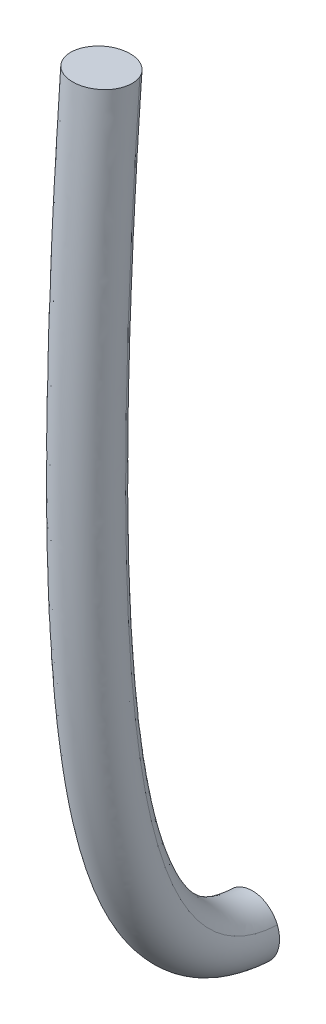
ISO-10303-21;
HEADER;
FILE_DESCRIPTION(('STEP AP214'),'2;1');
FILE_NAME('part.step','',(''),(''),'','','');
FILE_SCHEMA(('AUTOMOTIVE_DESIGN { 1 0 10303 214 1 1 1 1 }'));
ENDSEC;
DATA;
#1=APPLICATION_CONTEXT('core data for automotive mechanical design processes');
#2=APPLICATION_PROTOCOL_DEFINITION('international standard','automotive_design',2000,#1);
#3=PRODUCT_CONTEXT('',#1,'mechanical');
#4=PRODUCT('Part','Part','',(#3));
#5=PRODUCT_RELATED_PRODUCT_CATEGORY('part','',(#4));
#6=PRODUCT_DEFINITION_FORMATION('','',#4);
#7=PRODUCT_DEFINITION_CONTEXT('part definition',#1,'design');
#8=PRODUCT_DEFINITION('design','',#6,#7);
#9=PRODUCT_DEFINITION_SHAPE('','',#8);
#10=(LENGTH_UNIT() NAMED_UNIT(*) SI_UNIT(.MILLI.,.METRE.));
#11=(NAMED_UNIT(*) PLANE_ANGLE_UNIT() SI_UNIT($,.RADIAN.));
#12=(NAMED_UNIT(*) SI_UNIT($,.STERADIAN.) SOLID_ANGLE_UNIT());
#13=UNCERTAINTY_MEASURE_WITH_UNIT(LENGTH_MEASURE(1.E-05),#10,'distance_accuracy_value','');
#14=(GEOMETRIC_REPRESENTATION_CONTEXT(3) GLOBAL_UNCERTAINTY_ASSIGNED_CONTEXT((#13)) GLOBAL_UNIT_ASSIGNED_CONTEXT((#10,
#11,#12)) REPRESENTATION_CONTEXT('',''));
#15=CARTESIAN_POINT('',(0.,0.,0.));
#16=DIRECTION('',(0.,0.,1.));
#17=DIRECTION('',(1.,0.,0.));
#18=AXIS2_PLACEMENT_3D('',#15,#16,#17);
#19=CARTESIAN_POINT('',(-9.105,-7.38568943191456,13.8327099550486));
#20=CARTESIAN_POINT('',(-9.10499999999981,-7.37642950308164,14.0005635497388));
#21=CARTESIAN_POINT('',(-9.10499999999962,-7.2763037819047,14.3051950304054));
#22=CARTESIAN_POINT('',(-9.10499999999973,-6.87048956486697,14.6647993958872));
#23=CARTESIAN_POINT('',(-9.10500000000012,-6.18721559292787,14.918746420687));
#24=CARTESIAN_POINT('',(-9.10500000000062,-5.06638179698164,15.0917595130935));
#25=CARTESIAN_POINT('',(-9.1050000000009,-3.380981097536,15.1354740723718));
#26=CARTESIAN_POINT('',(-9.10500000000044,-1.83527381521949,15.0610044224056));
#27=CARTESIAN_POINT('',(-9.105,-1.00000001490137,14.9999998509838));
#28=CARTESIAN_POINT('',(-9.10500000000102,-7.43610265920569,13.8354910864138));
#29=CARTESIAN_POINT('',(-9.10500000000083,-7.42638032085317,14.0117267217746));
#30=CARTESIAN_POINT('',(-9.10500000000063,-7.31962447141035,14.3361269179826));
#31=CARTESIAN_POINT('',(-9.10500000000075,-6.8938950895577,14.7107979897723));
#32=CARTESIAN_POINT('',(-9.10500000000114,-6.19822110732719,14.9682797622087));
#33=CARTESIAN_POINT('',(-9.10500000000164,-5.0694640529198,15.1423547779607));
#34=CARTESIAN_POINT('',(-9.10500000000192,-3.37989141140348,15.1859681663453));
#35=CARTESIAN_POINT('',(-9.10500000000146,-1.83238214013707,15.1114175914059));
#36=CARTESIAN_POINT('',(-9.10500000000102,-0.996322261093759,15.0503556083956));
#37=CARTESIAN_POINT('',(-9.08146531039236,-7.50310309534748,13.8391872793466));
#38=CARTESIAN_POINT('',(-9.08146531039217,-7.49276663369277,14.0265550525149));
#39=CARTESIAN_POINT('',(-9.08146531039198,-7.37719288054939,14.3772271643529));
#40=CARTESIAN_POINT('',(-9.0814653103921,-6.92500688525762,14.7719139223937));
#41=CARTESIAN_POINT('',(-9.08146531039248,-6.21285424479348,15.0341004564437));
#42=CARTESIAN_POINT('',(-9.08146531039299,-5.07356612743354,15.2095902229776));
#43=CARTESIAN_POINT('',(-9.08146531039327,-3.37844837624376,15.2530725672719));
#44=CARTESIAN_POINT('',(-9.08146531039281,-1.82853830004835,15.1784178966304));
#45=CARTESIAN_POINT('',(-9.08146531039237,-0.991434434577342,15.1172796656346));
#46=CARTESIAN_POINT('',(-9.00948257475563,-7.57470691483419,13.8431374257455));
#47=CARTESIAN_POINT('',(-9.00948257475544,-7.56371470708373,14.0423918279974));
#48=CARTESIAN_POINT('',(-9.00948257475525,-7.43870883760575,14.4211393200185));
#49=CARTESIAN_POINT('',(-9.00948257475537,-6.95826326955372,14.8372058999106));
#50=CARTESIAN_POINT('',(-9.00948257475575,-6.22850145484224,15.1044297316689));
#51=CARTESIAN_POINT('',(-9.00948257475626,-5.07795758403853,15.2814360042039));
#52=CARTESIAN_POINT('',(-9.00948257475654,-3.37691307979628,15.3247828349651));
#53=CARTESIAN_POINT('',(-9.00948257475608,-1.82442939038039,15.2500215052324));
#54=CARTESIAN_POINT('',(-9.00948257475564,-0.986210781304079,15.1888018584711));
#55=CARTESIAN_POINT('',(-8.91616514132677,-7.619939109025,13.8456327366139));
#56=CARTESIAN_POINT('',(-8.91616514132658,-7.60853182470396,14.0524111809729));
#57=CARTESIAN_POINT('',(-8.91616514132639,-7.47757998597928,14.448896260173));
#58=CARTESIAN_POINT('',(-8.91616514132651,-6.97926105841303,14.8784847931966));
#59=CARTESIAN_POINT('',(-8.9161651413269,-6.23837304198978,15.1488770235441));
#60=CARTESIAN_POINT('',(-8.9161651413274,-5.08072057261603,15.3268345752294));
#61=CARTESIAN_POINT('',(-8.91616514132768,-3.3759330999472,15.3700891296108));
#62=CARTESIAN_POINT('',(-8.91616514132722,-1.82183521862582,15.2952536706483));
#63=CARTESIAN_POINT('',(-8.91616514132678,-0.982910995050587,15.2339824890369));
#64=CARTESIAN_POINT('',(-8.77494921033092,-7.60399624955929,13.8447532216751));
#65=CARTESIAN_POINT('',(-8.77494921033073,-7.59273544829279,14.0488763856638));
#66=CARTESIAN_POINT('',(-8.77494921033053,-7.46387670201349,14.439109041196));
#67=CARTESIAN_POINT('',(-8.77494921033065,-6.97186225981292,14.8639279995456));
#68=CARTESIAN_POINT('',(-8.77494921033103,-6.23489639857072,15.1332064342758));
#69=CARTESIAN_POINT('',(-8.77494921033154,-5.0797491143025,15.3108301425632));
#70=CARTESIAN_POINT('',(-8.77494921033182,-3.37628070540644,15.3541186667505));
#71=CARTESIAN_POINT('',(-8.77494921033136,-1.82274926899322,15.2793107986999));
#72=CARTESIAN_POINT('',(-8.77494921033092,-0.984074061080251,15.2180578040516));
#73=CARTESIAN_POINT('',(-8.64809715106471,-7.47839150528102,13.8378240224806));
#74=CARTESIAN_POINT('',(-8.64809715106452,-7.4682818720693,14.0210801042733));
#75=CARTESIAN_POINT('',(-8.64809715106433,-7.35595567703182,14.3620615157661));
#76=CARTESIAN_POINT('',(-8.64809715106445,-6.91353595967043,14.7493596828973));
#77=CARTESIAN_POINT('',(-8.64809715106484,-6.20746204715733,15.0098162201342));
#78=CARTESIAN_POINT('',(-8.64809715106534,-5.07205743187922,15.1847867602238));
#79=CARTESIAN_POINT('',(-8.64809715106562,-3.37898449738882,15.2283199992013));
#80=CARTESIAN_POINT('',(-8.64809715106516,-1.82995546412401,15.1537063147466));
#81=CARTESIAN_POINT('',(-8.64809715106472,-0.993237198442189,15.0925962461927));
#82=CARTESIAN_POINT('',(-8.6480059034482,-7.34852746814265,13.8306598521566));
#83=CARTESIAN_POINT('',(-8.64800590344801,-7.3396083096454,13.9923363447521));
#84=CARTESIAN_POINT('',(-8.64800590344782,-7.24437133606725,14.2823956349796));
#85=CARTESIAN_POINT('',(-8.64800590344793,-6.85323510592148,14.6308954335856));
#86=CARTESIAN_POINT('',(-8.64800590344832,-6.17910149081105,14.882235310454));
#87=CARTESIAN_POINT('',(-8.64800590344882,-5.06410848745263,15.0544648645908));
#88=CARTESIAN_POINT('',(-8.6480059034491,-3.38178323039158,15.0982532600921));
#89=CARTESIAN_POINT('',(-8.64800590344865,-1.83740556403017,15.0238425132109));
#90=CARTESIAN_POINT('',(-8.6480059034482,-1.00271106041694,14.9628802509663));
#91=CARTESIAN_POINT('',(-8.67710475632972,-7.28816562138308,13.8273298882899));
#92=CARTESIAN_POINT('',(-8.67710475632953,-7.27979965151865,13.9789787983587));
#93=CARTESIAN_POINT('',(-8.67710475632933,-7.19250813194987,14.2453695060999));
#94=CARTESIAN_POINT('',(-8.67710475632944,-6.82520490518642,14.5758384875859));
#95=CARTESIAN_POINT('',(-8.67710475632983,-6.16591694551542,14.8229383725538));
#96=CARTESIAN_POINT('',(-8.67710475633033,-5.06041172817504,14.9938926714532));
#97=CARTESIAN_POINT('',(-8.67710475633061,-3.38308225429993,15.0377984476486));
#98=CARTESIAN_POINT('',(-8.67710475633016,-1.84086869132353,14.9634807950281));
#99=CARTESIAN_POINT('',(-8.67710475632971,-1.00711458750065,14.9025872152756));
#100=B_SPLINE_SURFACE_WITH_KNOTS('',3,3,((#19,#20,#21,#22,#23,#24,#25,#26,#27),(#28,#29,#30,#31,
#32,#33,#34,#35,#36),(#37,#38,#39,#40,#41,#42,#43,#44,#45),(#46,#47,#48,#49,#50,#51,#52,#53,
#54),(#55,#56,#57,#58,#59,#60,#61,#62,#63),(#64,#65,#66,#67,#68,#69,#70,#71,#72),(#73,#74,#75,
#76,#77,#78,#79,#80,#81),(#82,#83,#84,#85,#86,#87,#88,#89,#90),(#91,#92,#93,#94,#95,#96,#97,#98,
#99)),.UNSPECIFIED.,.F.,.F.,.F.,(4,1,1,1,1,1,4),(4,1,1,1,1,1,4),(-3.14159265358979,
-2.46839422782055,-2.24399475256414,-1.79519580205131,-1.12199737628207,-0.448798950512828,
0.448798950512828),(0.,0.142857142857143,0.285714285714286,0.428571428571429,0.571428571428571,
0.785714285714286,1.),.UNSPECIFIED.);
#101=CARTESIAN_POINT('',(-9.105,-7.38568943191456,13.8327099550486));
#102=CARTESIAN_POINT('',(-9.10499999999981,-7.37642950308164,14.0005635497388));
#103=CARTESIAN_POINT('',(-9.10499999999962,-7.2763037819047,14.3051950304054));
#104=CARTESIAN_POINT('',(-9.10499999999973,-6.87048956486697,14.6647993958872));
#105=CARTESIAN_POINT('',(-9.10500000000012,-6.18721559292787,14.918746420687));
#106=CARTESIAN_POINT('',(-9.10500000000062,-5.06638179698164,15.0917595130935));
#107=CARTESIAN_POINT('',(-9.1050000000009,-3.380981097536,15.1354740723718));
#108=CARTESIAN_POINT('',(-9.10500000000044,-1.83527381521949,15.0610044224056));
#109=CARTESIAN_POINT('',(-9.105,-1.00000001490137,14.9999998509838));
#110=B_SPLINE_CURVE_WITH_KNOTS('',3,(#101,#102,#103,#104,#105,#106,#107,#108,#109),
.UNSPECIFIED.,.F.,.F.,(4,1,1,1,1,1,4),(0.,0.142857142857143,0.285714285714286,0.428571428571429,
0.571428571428571,0.785714285714286,1.),.UNSPECIFIED.);
#111=CARTESIAN_POINT('',(-9.105,-7.38568943191456,13.8327099550486));
#112=VERTEX_POINT('',#111);
#113=CARTESIAN_POINT('',(-9.105,-1.00000001490137,14.9999998509838));
#114=VERTEX_POINT('',#113);
#115=EDGE_CURVE('E11',#112,#114,#110,.T.);
#116=CARTESIAN_POINT('',(-9.105,-7.38568943191456,13.8327099550486));
#117=CARTESIAN_POINT('',(-9.1050214182144,-7.4110260997773,13.8341076953931));
#118=CARTESIAN_POINT('',(-9.10052632430405,-7.43643532115182,13.8355094382754));
#119=CARTESIAN_POINT('',(-9.08357993178067,-7.48438196765205,13.8381544965191));
#120=CARTESIAN_POINT('',(-9.07113383472841,-7.50692125873844,13.8393979148194));
#121=CARTESIAN_POINT('',(-9.03931693766627,-7.54640347551307,13.8415760184112));
#122=CARTESIAN_POINT('',(-9.01995831505981,-7.56335614248688,13.8425112410974));
#123=CARTESIAN_POINT('',(-8.97691571487194,-7.58996073453296,13.8439789286344));
#124=CARTESIAN_POINT('',(-8.95326058543414,-7.59965926734387,13.8445139646803));
#125=CARTESIAN_POINT('',(-8.90399594580047,-7.61052243780771,13.8451132499418));
#126=CARTESIAN_POINT('',(-8.87838140225012,-7.61166429692955,13.8451762425409));
#127=CARTESIAN_POINT('',(-8.8281120965226,-7.60564094285516,13.8448439539761));
#128=CARTESIAN_POINT('',(-8.80345890908751,-7.59846264681104,13.8444479510747));
#129=CARTESIAN_POINT('',(-8.75799660394507,-7.5762056621202,13.8432201066865));
#130=CARTESIAN_POINT('',(-8.73719316373903,-7.56111542883224,13.84238762832));
#131=CARTESIAN_POINT('',(-8.70149443337754,-7.52495361656494,13.840392700486));
#132=CARTESIAN_POINT('',(-8.6866224371932,-7.50385900191019,13.8392289802165));
#133=CARTESIAN_POINT('',(-8.66544444875788,-7.45822876710493,13.8367117107608));
#134=CARTESIAN_POINT('',(-8.65896983605404,-7.43377215630776,13.83536252026));
#135=CARTESIAN_POINT('',(-8.65520704488175,-7.39652598319642,13.8333077718172));
#136=CARTESIAN_POINT('',(-8.65496273350068,-7.38393258547078,13.8326130356281));
#137=CARTESIAN_POINT('',(-8.65649781828685,-7.35885784769442,13.831229745102));
#138=CARTESIAN_POINT('',(-8.65827619433314,-7.34637645435405,13.8305411878251));
#139=CARTESIAN_POINT('',(-8.66399448939332,-7.32135731807689,13.8291609646502));
#140=CARTESIAN_POINT('',(-8.6680221703353,-7.30883928197332,13.8284703859131));
#141=CARTESIAN_POINT('',(-8.67833415467918,-7.28477042606569,13.8271425865698));
#142=CARTESIAN_POINT('',(-8.68461703032502,-7.27321899999697,13.8265053325181));
#143=CARTESIAN_POINT('',(-8.69861227691209,-7.25220945954627,13.8253463055116));
#144=CARTESIAN_POINT('',(-8.70618982615349,-7.24266063420885,13.8248195283328));
#145=CARTESIAN_POINT('',(-8.7227549312015,-7.22485209610128,13.823837090061));
#146=CARTESIAN_POINT('',(-8.73174438114589,-7.21659414523651,13.8233815261664));
#147=CARTESIAN_POINT('',(-8.75149505489487,-7.20109499251193,13.8225264890642));
#148=CARTESIAN_POINT('',(-8.76233191323985,-7.19394963845643,13.8221323034636));
#149=CARTESIAN_POINT('',(-8.78503950785307,-7.18157638294131,13.8214497117937));
#150=CARTESIAN_POINT('',(-8.79690874266469,-7.1763457526202,13.8211611551822));
#151=CARTESIAN_POINT('',(-8.82134334935088,-7.16811573338113,13.8207071321833));
#152=CARTESIAN_POINT('',(-8.83390506727968,-7.16510565004675,13.8205410758202));
#153=CARTESIAN_POINT('',(-8.85936848653538,-7.16139856487643,13.8203365681663));
#154=CARTESIAN_POINT('',(-8.87227039706104,-7.16070302144048,13.8202981973306));
#155=CARTESIAN_POINT('',(-8.89728704813144,-7.16145552539623,13.8203397104902));
#156=CARTESIAN_POINT('',(-8.90940586085246,-7.16278714917183,13.820413171779));
#157=CARTESIAN_POINT('',(-8.93329654203036,-7.16730736336754,13.8206625370777));
#158=CARTESIAN_POINT('',(-8.94506822920407,-7.17049690663656,13.820838493653));
#159=CARTESIAN_POINT('',(-8.96887957701676,-7.17899278605724,13.8213071832808));
#160=CARTESIAN_POINT('',(-8.9808673348545,-7.18444604240543,13.8216080214355));
#161=CARTESIAN_POINT('',(-9.00367547434582,-7.19737018494068,13.8223210037242));
#162=CARTESIAN_POINT('',(-9.01449749288069,-7.20483818903509,13.8227329888626));
#163=CARTESIAN_POINT('',(-9.04354906736174,-7.22920149901619,13.8240770322654));
#164=CARTESIAN_POINT('',(-9.05976254425968,-7.24855970424001,13.8251449605575));
#165=CARTESIAN_POINT('',(-9.08535768266723,-7.29145200729815,13.827511187355));
#166=CARTESIAN_POINT('',(-9.09469654696893,-7.31501114894008,13.8288108674445));
#167=CARTESIAN_POINT('',(-9.10327118067283,-7.35460506897152,13.8309951333363));
#168=CARTESIAN_POINT('',(-9.10498684994159,-7.37013357575955,13.8318517898053));
#169=CARTESIAN_POINT('',(-9.105,-7.38568943191456,13.8327099550486));
#170=B_SPLINE_CURVE_WITH_KNOTS('',3,(#116,#117,#118,#119,#120,#121,#122,#123,#124,#125,#126,
#127,#128,#129,#130,#131,#132,#133,#134,#135,#136,#137,#138,#139,#140,#141,#142,#143,#144,#145,
#146,#147,#148,#149,#150,#151,#152,#153,#154,#155,#156,#157,#158,#159,#160,#161,#162,#163,#164,
#165,#166,#167,#168,#169),.UNSPECIFIED.,.T.,.F.,(4,2,2,2,2,2,2,2,2,2,2,2,2,2,2,2,2,2,2,2,2,2,2,
2,2,2,4),(0.,0.0759527456977868,0.151855853783778,0.227625902063934,0.302904845076365,
0.378384115540723,0.453982232946316,0.529690967006227,0.605694163984246,0.680146293164477,
0.717870420274365,0.755575530053903,0.794866394105672,0.834132426993242,0.870582625112739,
0.907082147444021,0.945863662438832,0.984589688878527,1.02312796631791,1.06169052227225,
1.09812038083776,1.13456893921849,1.17388788724623,1.21315088512766,1.28747904048858,
1.36226609312341,1.40889850718249),.UNSPECIFIED.);
#171=CARTESIAN_POINT('',(-8.67710475632972,-7.28816562138308,13.8273298882899));
#172=VERTEX_POINT('',#171);
#173=EDGE_CURVE('E47',#112,#172,#170,.T.);
#174=CARTESIAN_POINT('',(-8.67710475632972,-7.28816562138308,13.8273298882899));
#175=CARTESIAN_POINT('',(-8.67710475632953,-7.27979965151865,13.9789787983587));
#176=CARTESIAN_POINT('',(-8.67710475632933,-7.19250813194987,14.2453695060999));
#177=CARTESIAN_POINT('',(-8.67710475632944,-6.82520490518642,14.5758384875859));
#178=CARTESIAN_POINT('',(-8.67710475632983,-6.16591694551542,14.8229383725538));
#179=CARTESIAN_POINT('',(-8.67710475633033,-5.06041172817504,14.9938926714532));
#180=CARTESIAN_POINT('',(-8.67710475633061,-3.38308225429993,15.0377984476486));
#181=CARTESIAN_POINT('',(-8.67710475633016,-1.84086869132353,14.9634807950281));
#182=CARTESIAN_POINT('',(-8.67710475632971,-1.00711458750065,14.9025872152756));
#183=B_SPLINE_CURVE_WITH_KNOTS('',3,(#174,#175,#176,#177,#178,#179,#180,#181,#182),
.UNSPECIFIED.,.F.,.F.,(4,1,1,1,1,1,4),(0.,0.142857142857143,0.285714285714286,0.428571428571429,
0.571428571428571,0.785714285714286,1.),.UNSPECIFIED.);
#184=CARTESIAN_POINT('',(-8.67710475632971,-1.00711458750065,14.9025872152756));
#185=VERTEX_POINT('',#184);
#186=EDGE_CURVE('E29',#172,#185,#183,.T.);
#187=CARTESIAN_POINT('',(-9.105,-1.00000001490137,14.9999998509838));
#188=CARTESIAN_POINT('',(-9.10498903621977,-1.00092583577944,14.9873235235346));
#189=CARTESIAN_POINT('',(-9.1038470021153,-1.00185193786934,14.9746433457367));
#190=CARTESIAN_POINT('',(-9.09941624170349,-1.00367803777606,14.9496404095094));
#191=CARTESIAN_POINT('',(-9.09612241599672,-1.00457796826532,14.9373185729278));
#192=CARTESIAN_POINT('',(-9.08757842467712,-1.00632403905273,14.9134113943634));
#193=CARTESIAN_POINT('',(-9.08233395260261,-1.00717032758841,14.9018240227143));
#194=CARTESIAN_POINT('',(-9.07003212959537,-1.00878907520263,14.8796601513851));
#195=CARTESIAN_POINT('',(-9.06297606675981,-1.00956158620603,14.8690829407507));
#196=CARTESIAN_POINT('',(-9.04695123791964,-1.01103220643696,14.8489472276315));
#197=CARTESIAN_POINT('',(-9.03793169185556,-1.01172740862973,14.8394285282291));
#198=CARTESIAN_POINT('',(-9.01828466853312,-1.01298392430383,14.8222243319238));
#199=CARTESIAN_POINT('',(-9.00765827076202,-1.0135453270246,14.8145376131558));
#200=CARTESIAN_POINT('',(-8.9859986572648,-1.01448708766674,14.801643038664));
#201=CARTESIAN_POINT('',(-8.97504545515286,-1.01487733893827,14.7962997233181));
#202=CARTESIAN_POINT('',(-8.95242350932686,-1.01552866097233,14.7873818304795));
#203=CARTESIAN_POINT('',(-8.94075380693721,-1.01578955422617,14.7838096834333));
#204=CARTESIAN_POINT('',(-8.91626828064981,-1.01618855619008,14.778346553721));
#205=CARTESIAN_POINT('',(-8.90342609971037,-1.01631813133665,14.7765724124956));
#206=CARTESIAN_POINT('',(-8.87763745740146,-1.01641905478886,14.7751905698977));
#207=CARTESIAN_POINT('',(-8.86469116881291,-1.01639062617715,14.7755798140806));
#208=CARTESIAN_POINT('',(-8.83911444491397,-1.01616563358676,14.7786604097088));
#209=CARTESIAN_POINT('',(-8.82648306581641,-1.01596965610962,14.7813437307829));
#210=CARTESIAN_POINT('',(-8.8019123378637,-1.01541467730588,14.7889424933625));
#211=CARTESIAN_POINT('',(-8.78997340650794,-1.01505557875719,14.7938592660317));
#212=CARTESIAN_POINT('',(-8.7677291395291,-1.01422103019526,14.8052858941128));
#213=CARTESIAN_POINT('',(-8.75737000444941,-1.01375309863906,14.8116928069085));
#214=CARTESIAN_POINT('',(-8.73776380738157,-1.012706040097,14.8260291188801));
#215=CARTESIAN_POINT('',(-8.72851738212842,-1.01212684993221,14.8339593831008));
#216=CARTESIAN_POINT('',(-8.71068265984555,-1.01082000803148,14.8518526454484));
#217=CARTESIAN_POINT('',(-8.70220611615915,-1.01008418812025,14.8619274821251));
#218=CARTESIAN_POINT('',(-8.68717550985443,-1.00851689678642,14.883386814731));
#219=CARTESIAN_POINT('',(-8.68061862997439,-1.00768556805293,14.8947693569628));
#220=CARTESIAN_POINT('',(-8.66487202146753,-1.00516516607807,14.9292786680982));
#221=CARTESIAN_POINT('',(-8.65857615992246,-1.00337419105203,14.9538006749152));
#222=CARTESIAN_POINT('',(-8.65512585397084,-1.00065795526206,14.990991340106));
#223=CARTESIAN_POINT('',(-8.65498683574524,-0.999743693033354,15.003509406678));
#224=CARTESIAN_POINT('',(-8.65670757890611,-0.997924254830562,15.0284211309418));
#225=CARTESIAN_POINT('',(-8.6585660315778,-0.997019073298899,15.0408148647278));
#226=CARTESIAN_POINT('',(-8.66443361711301,-0.995200140671707,15.065719666657));
#227=CARTESIAN_POINT('',(-8.66854169812078,-0.994288063670913,15.0782078131168));
#228=CARTESIAN_POINT('',(-8.67899447379019,-0.992534406378076,15.102218866015));
#229=CARTESIAN_POINT('',(-8.68533886168053,-0.991692816436372,15.1137419045764));
#230=CARTESIAN_POINT('',(-8.69948922995563,-0.990157395014733,15.1347648747579));
#231=CARTESIAN_POINT('',(-8.70717258973298,-0.989457501450095,15.1443478083631));
#232=CARTESIAN_POINT('',(-8.72397475762615,-0.988155752019444,15.1621713446761));
#233=CARTESIAN_POINT('',(-8.73309411769347,-0.987553934032218,15.170411428748));
#234=CARTESIAN_POINT('',(-8.75296187098776,-0.986440129721863,15.1856616229126));
#235=CARTESIAN_POINT('',(-8.76376381769068,-0.985933180795942,15.1926027610282));
#236=CARTESIAN_POINT('',(-8.78641242842208,-0.985064215137902,15.2045006275423));
#237=CARTESIAN_POINT('',(-8.79825871094259,-0.98470214574515,15.2094580769696));
#238=CARTESIAN_POINT('',(-8.82237067786302,-0.984135804201727,15.2172124180332));
#239=CARTESIAN_POINT('',(-8.83462294490906,-0.983928474514959,15.220051173414));
#240=CARTESIAN_POINT('',(-8.85942973358345,-0.983661556709193,15.2237058085469));
#241=CARTESIAN_POINT('',(-8.87198435344894,-0.983602017280727,15.2245210216288));
#242=CARTESIAN_POINT('',(-8.89738617053946,-0.983634280163277,15.2240792786594));
#243=CARTESIAN_POINT('',(-8.91023259016204,-0.983730013312219,15.2227685016262));
#244=CARTESIAN_POINT('',(-8.93549041219548,-0.98408489793876,15.2179094259243));
#245=CARTESIAN_POINT('',(-8.94790193618779,-0.984344003352219,15.2143617579653));
#246=CARTESIAN_POINT('',(-8.97156740750917,-0.98500255667611,15.2053448543997));
#247=CARTESIAN_POINT('',(-8.98284496027551,-0.985397542732983,15.1999367104342));
#248=CARTESIAN_POINT('',(-9.00437112062539,-0.986315682934546,15.187365546708));
#249=CARTESIAN_POINT('',(-9.01461953526561,-0.986838861049729,15.1802021987435));
#250=CARTESIAN_POINT('',(-9.03404386802854,-0.988016658026744,15.164075817817));
#251=CARTESIAN_POINT('',(-9.04318541159586,-0.988674312134117,15.1550712263125));
#252=CARTESIAN_POINT('',(-9.05974572471368,-0.990094621648831,15.1356243668667));
#253=CARTESIAN_POINT('',(-9.0671645894837,-0.990857271248928,15.1251821784382));
#254=CARTESIAN_POINT('',(-9.08625569481287,-0.99322671063056,15.0927398451703));
#255=CARTESIAN_POINT('',(-9.09533580097951,-0.994950982169095,15.0691311416386));
#256=CARTESIAN_POINT('',(-9.10343742714007,-0.997806019523753,15.0300400072251));
#257=CARTESIAN_POINT('',(-9.10501299323331,-0.998902819735146,15.0150226329626));
#258=CARTESIAN_POINT('',(-9.105,-1.00000001490137,14.9999998509838));
#259=B_SPLINE_CURVE_WITH_KNOTS('',3,(#187,#188,#189,#190,#191,#192,#193,#194,#195,#196,#197,
#198,#199,#200,#201,#202,#203,#204,#205,#206,#207,#208,#209,#210,#211,#212,#213,#214,#215,#216,
#217,#218,#219,#220,#221,#222,#223,#224,#225,#226,#227,#228,#229,#230,#231,#232,#233,#234,#235,
#236,#237,#238,#239,#240,#241,#242,#243,#244,#245,#246,#247,#248,#249,#250,#251,#252,#253,#254,
#255,#256,#257,#258),.UNSPECIFIED.,.T.,.F.,(4,2,2,2,2,2,2,2,2,2,2,2,2,2,2,2,2,2,2,2,2,2,2,2,2,2,
2,2,2,2,2,2,2,2,2,4),(0.,0.0380929041572446,0.076276411447651,0.114349332472978,
0.152395257083241,0.191576163358274,0.23073086378663,0.267155768184832,0.303630518470026,
0.342347417950639,0.381009667640254,0.419537132419824,0.45808759021679,0.4945096504154,
0.530952454584784,0.570309420669355,0.609608334317711,0.684071322329467,0.721618308836419,
0.759140710074351,0.798464136536044,0.837782170800763,0.874530581834687,0.911293152388098,
0.949652549048757,0.987997990190523,1.02556409238688,1.06314256935669,1.10168730725091,
1.14022118199928,1.17759449714305,1.21497480602295,1.25331678016142,1.29165663447708,
1.36617399047263,1.41131809048012),.UNSPECIFIED.);
#260=EDGE_CURVE('E48',#185,#114,#259,.T.);
#261=ORIENTED_EDGE('',*,*,#115,.F.);
#262=ORIENTED_EDGE('',*,*,#173,.T.);
#263=ORIENTED_EDGE('',*,*,#186,.T.);
#264=ORIENTED_EDGE('',*,*,#260,.T.);
#265=EDGE_LOOP('',(#261,#262,#263,#264));
#266=FACE_BOUND('',#265,.T.);
#267=ADVANCED_FACE('F17',(#266),#100,.T.);
#268=CARTESIAN_POINT('',(-8.88,-7.38568943191911,13.8327099550486));
#269=DIRECTION('',(1.1126142427123E-12,0.0550829445172842,0.998481782118886));
#270=DIRECTION('',(0.,-0.998481782118886,0.0550829445172842));
#271=AXIS2_PLACEMENT_3D('',#268,#269,#270);
#272=PLANE('',#271);
#273=ORIENTED_EDGE('',*,*,#173,.F.);
#274=EDGE_CURVE('E50',#172,#112,#170,.T.);
#275=ORIENTED_EDGE('',*,*,#274,.F.);
#276=EDGE_LOOP('',(#273,#275));
#277=FACE_BOUND('',#276,.T.);
#278=ADVANCED_FACE('F54',(#277),#272,.F.);
#279=CARTESIAN_POINT('',(-8.88,-1.00000001490116,14.9999998509884));
#280=DIRECTION('',(5.32614965869058E-13,0.997343536648528,-0.0728414024124084));
#281=DIRECTION('',(0.,0.0728414024124084,0.997343536648528));
#282=AXIS2_PLACEMENT_3D('',#279,#280,#281);
#283=PLANE('',#282);
#284=EDGE_CURVE('E56',#114,#185,#259,.T.);
#285=ORIENTED_EDGE('',*,*,#284,.F.);
#286=ORIENTED_EDGE('',*,*,#260,.F.);
#287=EDGE_LOOP('',(#285,#286));
#288=FACE_BOUND('',#287,.T.);
#289=ADVANCED_FACE('F84',(#288),#283,.T.);
#290=CARTESIAN_POINT('',(-8.67710475632972,-7.28816562138308,13.8273298882899));
#291=CARTESIAN_POINT('',(-8.67710475632953,-7.27979965151865,13.9789787983587));
#292=CARTESIAN_POINT('',(-8.67710475632933,-7.19250813194987,14.2453695060999));
#293=CARTESIAN_POINT('',(-8.67710475632944,-6.82520490518642,14.5758384875859));
#294=CARTESIAN_POINT('',(-8.67710475632983,-6.16591694551542,14.8229383725538));
#295=CARTESIAN_POINT('',(-8.67710475633033,-5.06041172817504,14.9938926714532));
#296=CARTESIAN_POINT('',(-8.67710475633061,-3.38308225429993,15.0377984476486));
#297=CARTESIAN_POINT('',(-8.67710475633016,-1.84086869132353,14.9634807950281));
#298=CARTESIAN_POINT('',(-8.67710475632971,-1.00711458750065,14.9025872152756));
#299=CARTESIAN_POINT('',(-8.70620360921123,-7.2278037746235,13.8239999244233));
#300=CARTESIAN_POINT('',(-8.70620360921104,-7.21999099339191,13.9656212519653));
#301=CARTESIAN_POINT('',(-8.70620360921084,-7.14064492783248,14.2083433772203));
#302=CARTESIAN_POINT('',(-8.70620360921095,-6.79717470445136,14.5207815415861));
#303=CARTESIAN_POINT('',(-8.70620360921134,-6.15273240021978,14.7636414346536));
#304=CARTESIAN_POINT('',(-8.70620360921184,-5.05671496889744,14.9333204783156));
#305=CARTESIAN_POINT('',(-8.70620360921212,-3.38438127820828,14.977343635205));
#306=CARTESIAN_POINT('',(-8.70620360921167,-1.84433181861688,14.9031190768453));
#307=CARTESIAN_POINT('',(-8.70620360921122,-1.01151811458437,14.8422941795848));
#308=CARTESIAN_POINT('',(-8.82270330372758,-7.13477243002904,13.818867692184));
#309=CARTESIAN_POINT('',(-8.82270330372739,-7.12781186079797,13.9450410772731));
#310=CARTESIAN_POINT('',(-8.82270330372719,-7.06071707246531,14.1512855826004));
#311=CARTESIAN_POINT('',(-8.8227033037273,-6.7539691629385,14.4359414710862));
#312=CARTESIAN_POINT('',(-8.82270330372769,-6.13240628343301,14.672260436973));
#313=CARTESIAN_POINT('',(-8.82270330372819,-5.05101243970315,14.8399710150602));
#314=CARTESIAN_POINT('',(-8.82270330372847,-3.38637882183851,14.8841720872699));
#315=CARTESIAN_POINT('',(-8.82270330372801,-1.84966992789754,14.8100879772977));
#316=CARTESIAN_POINT('',(-8.82270330372757,-1.01830495209094,14.7493688885093));
#317=CARTESIAN_POINT('',(-9.04061126453986,-7.18477706306368,13.8216262827528));
#318=CARTESIAN_POINT('',(-9.04061126453967,-7.17735915290208,13.9560898308189));
#319=CARTESIAN_POINT('',(-9.04061126453947,-7.10366864948262,14.181939145516));
#320=CARTESIAN_POINT('',(-9.04061126453958,-6.7772011569225,14.4815140306788));
#321=CARTESIAN_POINT('',(-9.04061126453997,-6.14334264818912,14.7213605541165));
#322=CARTESIAN_POINT('',(-9.04061126454047,-5.05408714024625,14.8901349671553));
#323=CARTESIAN_POINT('',(-9.04061126454075,-3.38531387585107,14.9342461650339));
#324=CARTESIAN_POINT('',(-9.0406112645403,-1.84679944423835,14.8600923885261));
#325=CARTESIAN_POINT('',(-9.04061126453985,-1.01465700611665,14.7993165174523));
#326=CARTESIAN_POINT('',(-9.10499999999864,-7.31847179552639,13.8290017798951));
#327=CARTESIAN_POINT('',(-9.10499999999845,-7.30982729388697,13.9856996012998));
#328=CARTESIAN_POINT('',(-9.10499999999825,-7.21855811223311,14.2639759141102));
#329=CARTESIAN_POINT('',(-9.10499999999837,-6.83926850230995,14.6035130193404));
#330=CARTESIAN_POINT('',(-9.10499999999875,-6.17252459057393,14.8527288699801));
#331=CARTESIAN_POINT('',(-9.10499999999926,-5.06225736112905,15.0243171546361));
#332=CARTESIAN_POINT('',(-9.10499999999954,-3.3824205366795,15.0681577338976));
#333=CARTESIAN_POINT('',(-9.10499999999908,-1.83913128396928,14.99378700265));
#334=CARTESIAN_POINT('',(-9.10499999999864,-1.00490368664486,14.9328588411016));
#335=CARTESIAN_POINT('',(-9.105,-7.38568943191456,13.8327099550486));
#336=CARTESIAN_POINT('',(-9.10499999999981,-7.37642950308164,14.0005635497388));
#337=CARTESIAN_POINT('',(-9.10499999999962,-7.2763037819047,14.3051950304054));
#338=CARTESIAN_POINT('',(-9.10499999999973,-6.87048956486697,14.6647993958872));
#339=CARTESIAN_POINT('',(-9.10500000000012,-6.18721559292787,14.918746420687));
#340=CARTESIAN_POINT('',(-9.10500000000062,-5.06638179698164,15.0917595130935));
#341=CARTESIAN_POINT('',(-9.1050000000009,-3.380981097536,15.1354740723718));
#342=CARTESIAN_POINT('',(-9.10500000000044,-1.83527381521949,15.0610044224056));
#343=CARTESIAN_POINT('',(-9.105,-1.00000001490137,14.9999998509838));
#344=B_SPLINE_SURFACE_WITH_KNOTS('',3,3,((#290,#291,#292,#293,#294,#295,#296,#297,#298),(#299,
#300,#301,#302,#303,#304,#305,#306,#307),(#308,#309,#310,#311,#312,#313,#314,#315,#316),(#317,
#318,#319,#320,#321,#322,#323,#324,#325),(#326,#327,#328,#329,#330,#331,#332,#333,#334),(#335,
#336,#337,#338,#339,#340,#341,#342,#343)),.UNSPECIFIED.,.F.,.F.,.F.,(4,1,1,4),(4,1,1,1,1,1,4),
(0.448798950512828,1.34639685153848,2.24399475256414,3.14159265358979),(0.,0.142857142857143,
0.285714285714286,0.428571428571429,0.571428571428571,0.785714285714286,1.),.UNSPECIFIED.);
#345=ORIENTED_EDGE('',*,*,#274,.T.);
#346=ORIENTED_EDGE('',*,*,#115,.T.);
#347=ORIENTED_EDGE('',*,*,#284,.T.);
#348=ORIENTED_EDGE('',*,*,#186,.F.);
#349=EDGE_LOOP('',(#345,#346,#347,#348));
#350=FACE_BOUND('',#349,.T.);
#351=ADVANCED_FACE('F51',(#350),#344,.T.);
#352=CLOSED_SHELL('',(#267,#278,#289,#351));
#353=MANIFOLD_SOLID_BREP('B1',#352);
#354=ADVANCED_BREP_SHAPE_REPRESENTATION('',(#18,#353),#14);
#355=SHAPE_DEFINITION_REPRESENTATION(#9,#354);
ENDSEC;
END-ISO-10303-21;
